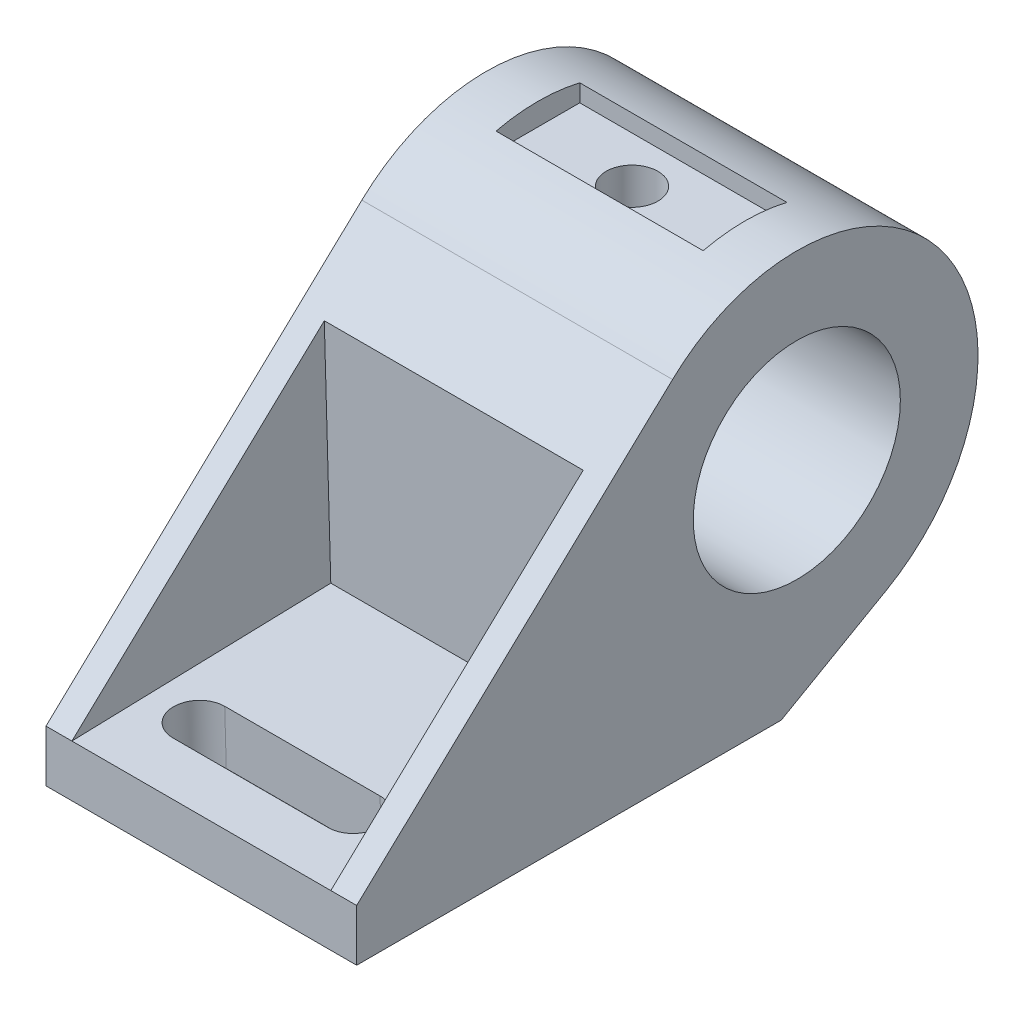
ISO-10303-21;
HEADER;
FILE_DESCRIPTION(('STEP AP214'),'2;1');
FILE_NAME('part.step','',(''),(''),'','','');
FILE_SCHEMA(('AUTOMOTIVE_DESIGN { 1 0 10303 214 1 1 1 1 }'));
ENDSEC;
DATA;
#1=APPLICATION_CONTEXT('core data for automotive mechanical design processes');
#2=APPLICATION_PROTOCOL_DEFINITION('international standard','automotive_design',2000,#1);
#3=PRODUCT_CONTEXT('',#1,'mechanical');
#4=PRODUCT('Part','Part','',(#3));
#5=PRODUCT_RELATED_PRODUCT_CATEGORY('part','',(#4));
#6=PRODUCT_DEFINITION_FORMATION('','',#4);
#7=PRODUCT_DEFINITION_CONTEXT('part definition',#1,'design');
#8=PRODUCT_DEFINITION('design','',#6,#7);
#9=PRODUCT_DEFINITION_SHAPE('','',#8);
#10=(LENGTH_UNIT() NAMED_UNIT(*) SI_UNIT(.MILLI.,.METRE.));
#11=(NAMED_UNIT(*) PLANE_ANGLE_UNIT() SI_UNIT($,.RADIAN.));
#12=(NAMED_UNIT(*) SI_UNIT($,.STERADIAN.) SOLID_ANGLE_UNIT());
#13=UNCERTAINTY_MEASURE_WITH_UNIT(LENGTH_MEASURE(1.E-05),#10,'distance_accuracy_value','');
#14=(GEOMETRIC_REPRESENTATION_CONTEXT(3) GLOBAL_UNCERTAINTY_ASSIGNED_CONTEXT((#13)) GLOBAL_UNIT_ASSIGNED_CONTEXT((#10,
#11,#12)) REPRESENTATION_CONTEXT('',''));
#15=CARTESIAN_POINT('',(0.,0.,0.));
#16=DIRECTION('',(0.,0.,1.));
#17=DIRECTION('',(1.,0.,0.));
#18=AXIS2_PLACEMENT_3D('',#15,#16,#17);
#19=CARTESIAN_POINT('',(-50.,42.,-5.43312891036364));
#20=DIRECTION('',(1.,0.,0.));
#21=DIRECTION('',(0.,0.,-1.));
#22=AXIS2_PLACEMENT_3D('',#19,#20,#21);
#23=CYLINDRICAL_SURFACE('',#22,35.);
#24=CARTESIAN_POINT('',(10.,42.,-5.43312891036364));
#25=DIRECTION('',(1.,0.,0.));
#26=DIRECTION('',(0.,0.,1.));
#27=AXIS2_PLACEMENT_3D('',#24,#25,#26);
#28=CIRCLE('',#27,35.);
#29=CARTESIAN_POINT('',(10.,11.5950440038065,-22.7691795237397));
#30=VERTEX_POINT('',#29);
#31=CARTESIAN_POINT('',(10.,67.4737167405877,18.568740921387));
#32=VERTEX_POINT('',#31);
#33=EDGE_CURVE('E267',#30,#32,#28,.T.);
#34=ORIENTED_EDGE('',*,*,#33,.F.);
#35=DIRECTION('',(1.,0.,0.));
#36=VECTOR('',#35,1.);
#37=CARTESIAN_POINT('',(-50.,11.5950440038065,-22.7691795237397));
#38=LINE('',#37,#36);
#39=CARTESIAN_POINT('',(-50.,11.5950440038065,-22.7691795237397));
#40=VERTEX_POINT('',#39);
#41=EDGE_CURVE('E284',#40,#30,#38,.T.);
#42=ORIENTED_EDGE('',*,*,#41,.F.);
#43=CARTESIAN_POINT('',(-50.,42.,-5.43312891036364));
#44=DIRECTION('',(1.,0.,0.));
#45=DIRECTION('',(0.,0.,1.));
#46=AXIS2_PLACEMENT_3D('',#43,#44,#45);
#47=CIRCLE('',#46,35.);
#48=CARTESIAN_POINT('',(-50.,67.4737167405877,18.568740921387));
#49=VERTEX_POINT('',#48);
#50=EDGE_CURVE('E252',#40,#49,#47,.T.);
#51=ORIENTED_EDGE('',*,*,#50,.T.);
#52=DIRECTION('',(1.,0.,0.));
#53=VECTOR('',#52,1.);
#54=CARTESIAN_POINT('',(-50.,67.4737167405877,18.568740921387));
#55=LINE('',#54,#53);
#56=EDGE_CURVE('E282',#49,#32,#55,.T.);
#57=ORIENTED_EDGE('',*,*,#56,.T.);
#58=EDGE_LOOP('',(#34,#42,#51,#57));
#59=FACE_BOUND('',#58,.T.);
#60=DIRECTION('',(1.,0.,0.));
#61=VECTOR('',#60,1.);
#62=CARTESIAN_POINT('',(-50.,76.0540565694001,2.64902619629556));
#63=LINE('',#62,#61);
#64=CARTESIAN_POINT('',(-40.,76.0540565694001,2.64902619629556));
#65=VERTEX_POINT('',#64);
#66=CARTESIAN_POINT('',(0.,76.0540565694001,2.64902619629556));
#67=VERTEX_POINT('',#66);
#68=EDGE_CURVE('E51',#65,#67,#63,.T.);
#69=ORIENTED_EDGE('',*,*,#68,.F.);
#70=CARTESIAN_POINT('',(-40.,42.,-5.43312891036364));
#71=DIRECTION('',(1.,0.,0.));
#72=DIRECTION('',(0.,0.,-1.));
#73=AXIS2_PLACEMENT_3D('',#70,#71,#72);
#74=CIRCLE('',#73,35.);
#75=CARTESIAN_POINT('',(-40.,76.0540565694001,-13.5152840170228));
#76=VERTEX_POINT('',#75);
#77=EDGE_CURVE('E11',#65,#76,#74,.F.);
#78=ORIENTED_EDGE('',*,*,#77,.T.);
#79=DIRECTION('',(1.,0.,0.));
#80=VECTOR('',#79,1.);
#81=CARTESIAN_POINT('',(-50.,76.0540565694001,-13.5152840170228));
#82=LINE('',#81,#80);
#83=CARTESIAN_POINT('',(0.,76.0540565694001,-13.5152840170228));
#84=VERTEX_POINT('',#83);
#85=EDGE_CURVE('E288',#84,#76,#82,.F.);
#86=ORIENTED_EDGE('',*,*,#85,.F.);
#87=CARTESIAN_POINT('',(0.,42.,-5.43312891036364));
#88=DIRECTION('',(1.,0.,0.));
#89=DIRECTION('',(0.,0.,-1.));
#90=AXIS2_PLACEMENT_3D('',#87,#88,#89);
#91=CIRCLE('',#90,35.);
#92=EDGE_CURVE('E277',#67,#84,#91,.F.);
#93=ORIENTED_EDGE('',*,*,#92,.F.);
#94=EDGE_LOOP('',(#69,#78,#86,#93));
#95=FACE_BOUND('',#94,.T.);
#96=ADVANCED_FACE('F37',(#59,#95),#23,.T.);
#97=CARTESIAN_POINT('',(-50.,0.,79.5668710896364));
#98=DIRECTION('',(0.,-1.,0.));
#99=DIRECTION('',(0.,0.,-1.));
#100=AXIS2_PLACEMENT_3D('',#97,#98,#99);
#101=PLANE('',#100);
#102=CARTESIAN_POINT('',(-35.4978255030121,0.,64.2692734919011));
#103=DIRECTION('',(0.,-1.,0.));
#104=DIRECTION('',(0.,0.,1.));
#105=AXIS2_PLACEMENT_3D('',#102,#103,#104);
#106=ELLIPSE('',#105,5.01190676980095,5.00991902859651);
#107=CARTESIAN_POINT('',(-35.4978255030121,0.,69.281180261702));
#108=VERTEX_POINT('',#107);
#109=CARTESIAN_POINT('',(-35.4978255030121,0.,59.2573667221001));
#110=VERTEX_POINT('',#109);
#111=EDGE_CURVE('E210',#108,#110,#106,.T.);
#112=ORIENTED_EDGE('',*,*,#111,.F.);
#113=DIRECTION('',(-1.,0.,0.));
#114=VECTOR('',#113,1.);
#115=CARTESIAN_POINT('',(-50.,0.,69.281180261702));
#116=LINE('',#115,#114);
#117=CARTESIAN_POINT('',(-5.49782550301206,0.,69.281180261702));
#118=VERTEX_POINT('',#117);
#119=EDGE_CURVE('E199',#118,#108,#116,.T.);
#120=ORIENTED_EDGE('',*,*,#119,.F.);
#121=CARTESIAN_POINT('',(-5.49782550301206,0.,64.2692734919011));
#122=DIRECTION('',(0.,-1.,0.));
#123=DIRECTION('',(0.,0.,1.));
#124=AXIS2_PLACEMENT_3D('',#121,#122,#123);
#125=ELLIPSE('',#124,5.01190676980096,5.00991902859652);
#126=CARTESIAN_POINT('',(-5.49782550301206,0.,59.2573667221001));
#127=VERTEX_POINT('',#126);
#128=EDGE_CURVE('E206',#127,#118,#125,.T.);
#129=ORIENTED_EDGE('',*,*,#128,.F.);
#130=DIRECTION('',(1.,0.,0.));
#131=VECTOR('',#130,1.);
#132=CARTESIAN_POINT('',(-50.,0.,59.2573667221001));
#133=LINE('',#132,#131);
#134=EDGE_CURVE('E208',#110,#127,#133,.T.);
#135=ORIENTED_EDGE('',*,*,#134,.F.);
#136=EDGE_LOOP('',(#112,#120,#129,#135));
#137=FACE_BOUND('',#136,.T.);
#138=DIRECTION('',(0.,0.,-1.));
#139=VECTOR('',#138,1.);
#140=CARTESIAN_POINT('',(10.,0.,79.5668710896364));
#141=LINE('',#140,#139);
#142=CARTESIAN_POINT('',(10.,0.,79.5668710896364));
#143=VERTEX_POINT('',#142);
#144=CARTESIAN_POINT('',(10.,0.,-2.43312891036364));
#145=VERTEX_POINT('',#144);
#146=EDGE_CURVE('E242',#143,#145,#141,.T.);
#147=ORIENTED_EDGE('',*,*,#146,.F.);
#148=DIRECTION('',(1.,0.,0.));
#149=VECTOR('',#148,1.);
#150=CARTESIAN_POINT('',(-50.,0.,79.5668710896364));
#151=LINE('',#150,#149);
#152=CARTESIAN_POINT('',(-50.,0.,79.5668710896364));
#153=VERTEX_POINT('',#152);
#154=EDGE_CURVE('E275',#153,#143,#151,.T.);
#155=ORIENTED_EDGE('',*,*,#154,.F.);
#156=DIRECTION('',(0.,0.,-1.));
#157=VECTOR('',#156,1.);
#158=CARTESIAN_POINT('',(-50.,0.,79.5668710896364));
#159=LINE('',#158,#157);
#160=CARTESIAN_POINT('',(-50.,0.,-2.43312891036364));
#161=VERTEX_POINT('',#160);
#162=EDGE_CURVE('E245',#153,#161,#159,.T.);
#163=ORIENTED_EDGE('',*,*,#162,.T.);
#164=DIRECTION('',(1.,0.,0.));
#165=VECTOR('',#164,1.);
#166=CARTESIAN_POINT('',(-50.,0.,-2.43312891036364));
#167=LINE('',#166,#165);
#168=EDGE_CURVE('E261',#161,#145,#167,.T.);
#169=ORIENTED_EDGE('',*,*,#168,.T.);
#170=EDGE_LOOP('',(#147,#155,#163,#169));
#171=FACE_BOUND('',#170,.T.);
#172=ADVANCED_FACE('F39',(#137,#171),#101,.T.);
#173=CARTESIAN_POINT('',(-50.,0.,79.5668710896364));
#174=DIRECTION('',(0.,0.,1.));
#175=DIRECTION('',(1.,0.,0.));
#176=AXIS2_PLACEMENT_3D('',#173,#174,#175);
#177=PLANE('',#176);
#178=DIRECTION('',(0.,-1.,0.));
#179=VECTOR('',#178,1.);
#180=CARTESIAN_POINT('',(10.,0.,79.5668710896364));
#181=LINE('',#180,#179);
#182=CARTESIAN_POINT('',(10.,10.,79.5668710896364));
#183=VERTEX_POINT('',#182);
#184=EDGE_CURVE('E249',#183,#143,#181,.T.);
#185=ORIENTED_EDGE('',*,*,#184,.F.);
#186=DIRECTION('',(1.,0.,0.));
#187=VECTOR('',#186,1.);
#188=CARTESIAN_POINT('',(-50.,10.,79.5668710896364));
#189=LINE('',#188,#187);
#190=CARTESIAN_POINT('',(5.,10.,79.5668710896364));
#191=VERTEX_POINT('',#190);
#192=EDGE_CURVE('E281',#191,#183,#189,.T.);
#193=ORIENTED_EDGE('',*,*,#192,.F.);
#194=DIRECTION('',(1.,0.,0.));
#195=VECTOR('',#194,1.);
#196=CARTESIAN_POINT('',(-45.,10.,79.5668710896364));
#197=LINE('',#196,#195);
#198=CARTESIAN_POINT('',(-45.,10.,79.5668710896364));
#199=VERTEX_POINT('',#198);
#200=EDGE_CURVE('E223',#199,#191,#197,.T.);
#201=ORIENTED_EDGE('',*,*,#200,.F.);
#202=CARTESIAN_POINT('',(-50.,10.,79.5668710896364));
#203=VERTEX_POINT('',#202);
#204=EDGE_CURVE('E278',#203,#199,#189,.T.);
#205=ORIENTED_EDGE('',*,*,#204,.F.);
#206=DIRECTION('',(0.,-1.,0.));
#207=VECTOR('',#206,1.);
#208=CARTESIAN_POINT('',(-50.,0.,79.5668710896364));
#209=LINE('',#208,#207);
#210=EDGE_CURVE('E258',#203,#153,#209,.T.);
#211=ORIENTED_EDGE('',*,*,#210,.T.);
#212=ORIENTED_EDGE('',*,*,#154,.T.);
#213=EDGE_LOOP('',(#185,#193,#201,#205,#211,#212));
#214=FACE_BOUND('',#213,.T.);
#215=ADVANCED_FACE('F314',(#214),#177,.T.);
#216=CARTESIAN_POINT('',(-50.,10.,79.5668710896364));
#217=DIRECTION('',(0.,0.727820478302506,0.68576770947859));
#218=DIRECTION('',(0.,-0.68576770947859,0.727820478302506));
#219=AXIS2_PLACEMENT_3D('',#216,#217,#218);
#220=PLANE('',#219);
#221=DIRECTION('',(0.,-0.68576770947859,0.727820478302506));
#222=VECTOR('',#221,1.);
#223=CARTESIAN_POINT('',(-45.,55.9292672426523,30.8211211941691));
#224=LINE('',#223,#222);
#225=CARTESIAN_POINT('',(-45.,55.9292672426523,30.8211211941691));
#226=VERTEX_POINT('',#225);
#227=EDGE_CURVE('E213',#226,#199,#224,.T.);
#228=ORIENTED_EDGE('',*,*,#227,.F.);
#229=DIRECTION('',(1.,0.,0.));
#230=VECTOR('',#229,1.);
#231=CARTESIAN_POINT('',(-45.,55.9292672426523,30.8211211941691));
#232=LINE('',#231,#230);
#233=CARTESIAN_POINT('',(5.,55.9292672426523,30.8211211941691));
#234=VERTEX_POINT('',#233);
#235=EDGE_CURVE('E231',#226,#234,#232,.T.);
#236=ORIENTED_EDGE('',*,*,#235,.T.);
#237=DIRECTION('',(0.,-0.68576770947859,0.727820478302506));
#238=VECTOR('',#237,1.);
#239=CARTESIAN_POINT('',(5.,55.9292672426523,30.8211211941691));
#240=LINE('',#239,#238);
#241=EDGE_CURVE('E212',#234,#191,#240,.T.);
#242=ORIENTED_EDGE('',*,*,#241,.T.);
#243=ORIENTED_EDGE('',*,*,#192,.T.);
#244=DIRECTION('',(0.,-0.68576770947859,0.727820478302506));
#245=VECTOR('',#244,1.);
#246=CARTESIAN_POINT('',(10.,10.,79.5668710896364));
#247=LINE('',#246,#245);
#248=EDGE_CURVE('E270',#32,#183,#247,.T.);
#249=ORIENTED_EDGE('',*,*,#248,.F.);
#250=ORIENTED_EDGE('',*,*,#56,.F.);
#251=DIRECTION('',(0.,-0.68576770947859,0.727820478302506));
#252=VECTOR('',#251,1.);
#253=CARTESIAN_POINT('',(-50.,10.,79.5668710896364));
#254=LINE('',#253,#252);
#255=EDGE_CURVE('E255',#49,#203,#254,.T.);
#256=ORIENTED_EDGE('',*,*,#255,.T.);
#257=ORIENTED_EDGE('',*,*,#204,.T.);
#258=EDGE_LOOP('',(#228,#236,#242,#243,#249,#250,#256,#257));
#259=FACE_BOUND('',#258,.T.);
#260=ADVANCED_FACE('F318',(#259),#220,.T.);
#261=CARTESIAN_POINT('',(-50.,11.5950440038065,-22.7691795237397));
#262=DIRECTION('',(0.,-0.868713028462672,-0.495315731810744));
#263=DIRECTION('',(0.,0.495315731810744,-0.868713028462672));
#264=AXIS2_PLACEMENT_3D('',#261,#262,#263);
#265=PLANE('',#264);
#266=DIRECTION('',(0.,0.495315731810744,-0.868713028462672));
#267=VECTOR('',#266,1.);
#268=CARTESIAN_POINT('',(10.,11.5950440038065,-22.7691795237397));
#269=LINE('',#268,#267);
#270=EDGE_CURVE('E264',#145,#30,#269,.T.);
#271=ORIENTED_EDGE('',*,*,#270,.F.);
#272=ORIENTED_EDGE('',*,*,#168,.F.);
#273=DIRECTION('',(0.,0.495315731810744,-0.868713028462672));
#274=VECTOR('',#273,1.);
#275=CARTESIAN_POINT('',(-50.,11.5950440038065,-22.7691795237397));
#276=LINE('',#275,#274);
#277=EDGE_CURVE('E248',#161,#40,#276,.T.);
#278=ORIENTED_EDGE('',*,*,#277,.T.);
#279=ORIENTED_EDGE('',*,*,#41,.T.);
#280=EDGE_LOOP('',(#271,#272,#278,#279));
#281=FACE_BOUND('',#280,.T.);
#282=ADVANCED_FACE('F320',(#281),#265,.T.);
#283=CARTESIAN_POINT('',(-50.,42.,-5.43312891036364));
#284=DIRECTION('',(-1.,0.,0.));
#285=DIRECTION('',(0.,0.,1.));
#286=AXIS2_PLACEMENT_3D('',#283,#284,#285);
#287=PLANE('',#286);
#288=CARTESIAN_POINT('',(-50.,42.,-5.43312891036364));
#289=DIRECTION('',(1.,0.,0.));
#290=DIRECTION('',(0.,0.,-1.));
#291=AXIS2_PLACEMENT_3D('',#288,#289,#290);
#292=CIRCLE('',#291,20.);
#293=CARTESIAN_POINT('',(-50.,42.,-25.4331289103636));
#294=VERTEX_POINT('',#293);
#295=EDGE_CURVE('E239',#294,#294,#292,.T.);
#296=ORIENTED_EDGE('',*,*,#295,.T.);
#297=EDGE_LOOP('',(#296));
#298=FACE_BOUND('',#297,.T.);
#299=ORIENTED_EDGE('',*,*,#162,.F.);
#300=ORIENTED_EDGE('',*,*,#210,.F.);
#301=ORIENTED_EDGE('',*,*,#255,.F.);
#302=ORIENTED_EDGE('',*,*,#50,.F.);
#303=ORIENTED_EDGE('',*,*,#277,.F.);
#304=EDGE_LOOP('',(#299,#300,#301,#302,#303));
#305=FACE_BOUND('',#304,.T.);
#306=ADVANCED_FACE('F322',(#298,#305),#287,.T.);
#307=CARTESIAN_POINT('',(10.,42.,-5.43312891036364));
#308=DIRECTION('',(-1.,0.,0.));
#309=DIRECTION('',(0.,0.,1.));
#310=AXIS2_PLACEMENT_3D('',#307,#308,#309);
#311=PLANE('',#310);
#312=CARTESIAN_POINT('',(10.,42.,-5.43312891036364));
#313=DIRECTION('',(1.,0.,0.));
#314=DIRECTION('',(0.,0.,-1.));
#315=AXIS2_PLACEMENT_3D('',#312,#313,#314);
#316=CIRCLE('',#315,20.);
#317=CARTESIAN_POINT('',(10.,42.,-25.4331289103636));
#318=VERTEX_POINT('',#317);
#319=EDGE_CURVE('E234',#318,#318,#316,.T.);
#320=ORIENTED_EDGE('',*,*,#319,.F.);
#321=EDGE_LOOP('',(#320));
#322=FACE_BOUND('',#321,.T.);
#323=ORIENTED_EDGE('',*,*,#146,.T.);
#324=ORIENTED_EDGE('',*,*,#270,.T.);
#325=ORIENTED_EDGE('',*,*,#33,.T.);
#326=ORIENTED_EDGE('',*,*,#248,.T.);
#327=ORIENTED_EDGE('',*,*,#184,.T.);
#328=EDGE_LOOP('',(#323,#324,#325,#326,#327));
#329=FACE_BOUND('',#328,.T.);
#330=ADVANCED_FACE('F328',(#322,#329),#311,.F.);
#331=CARTESIAN_POINT('',(-50.,42.,-5.43312891036364));
#332=DIRECTION('',(1.,0.,0.));
#333=DIRECTION('',(0.,0.,-1.));
#334=AXIS2_PLACEMENT_3D('',#331,#332,#333);
#335=CYLINDRICAL_SURFACE('',#334,20.);
#336=CARTESIAN_POINT('',(-21.0040889167803,61.1350109164291,0.385063010511854));
#337=CARTESIAN_POINT('',(-20.8670221858126,61.1350078519928,0.385067344026098));
#338=CARTESIAN_POINT('',(-20.730000875326,61.1367272382406,0.379425745192355));
#339=CARTESIAN_POINT('',(-20.4569261940195,61.1435493674619,0.356920581346241));
#340=CARTESIAN_POINT('',(-20.3208729567487,61.1486525684361,0.340055497229117));
#341=CARTESIAN_POINT('',(-20.0507302337885,61.1621058103301,0.295242769801606));
#342=CARTESIAN_POINT('',(-19.9166413883596,61.1704568864392,0.267291592984923));
#343=CARTESIAN_POINT('',(-19.6513675130776,61.1901781586751,0.200544239447774));
#344=CARTESIAN_POINT('',(-19.5201835871817,61.2015494819567,0.161744013582178));
#345=CARTESIAN_POINT('',(-19.2619255412233,61.2269807978453,0.0737124725848915));
#346=CARTESIAN_POINT('',(-19.1348436479616,61.2410353078421,0.0245024063153705));
#347=CARTESIAN_POINT('',(-18.885332194749,61.2714807055382,-0.083997977524717));
#348=CARTESIAN_POINT('',(-18.7629043764955,61.2878724572123,-0.143292024265557));
#349=CARTESIAN_POINT('',(-18.4038802833637,61.3399371423428,-0.335629090896694));
#350=CARTESIAN_POINT('',(-18.1752895517502,61.3785257157113,-0.483214057501158));
#351=CARTESIAN_POINT('',(-17.7399163883202,61.4608274482046,-0.817236903405134));
#352=CARTESIAN_POINT('',(-17.5338628961715,61.5046484422544,-1.00459201787022));
#353=CARTESIAN_POINT('',(-17.155594427672,61.5924601698431,-1.41086121597794));
#354=CARTESIAN_POINT('',(-16.9833845738588,61.6364509280514,-1.62978006839481));
#355=CARTESIAN_POINT('',(-16.6736467436738,61.7216633417738,-2.09933059845364));
#356=CARTESIAN_POINT('',(-16.5370631838169,61.7627917366976,-2.3506036081373));
#357=CARTESIAN_POINT('',(-16.3083877290295,61.8373165473308,-2.87371979874313));
#358=CARTESIAN_POINT('',(-16.2162904845595,61.8707138924578,-3.14556050182286));
#359=CARTESIAN_POINT('',(-16.0810102567119,61.926403025763,-3.69707817073685));
#360=CARTESIAN_POINT('',(-16.0369844706084,61.948882195668,-3.9765290184835));
#361=CARTESIAN_POINT('',(-15.9967025091636,61.9820151673714,-4.53952970278797));
#362=CARTESIAN_POINT('',(-16.0004369855806,61.9926712828836,-4.82307872634645));
#363=CARTESIAN_POINT('',(-16.0549564304612,62.0017889913764,-5.37743864584607));
#364=CARTESIAN_POINT('',(-16.1043683035879,62.0005966082415,-5.64838004826288));
#365=CARTESIAN_POINT('',(-16.246852812595,61.9878725872532,-6.17825864064669));
#366=CARTESIAN_POINT('',(-16.3399256546556,61.9763409005744,-6.43719577391957));
#367=CARTESIAN_POINT('',(-16.5669306096978,61.9450314438568,-6.93585882993901));
#368=CARTESIAN_POINT('',(-16.7008554041758,61.9252551505819,-7.17558818399606));
#369=CARTESIAN_POINT('',(-17.0057785111416,61.88033061331,-7.62962153195151));
#370=CARTESIAN_POINT('',(-17.1767820420613,61.8551816131698,-7.84392194042497));
#371=CARTESIAN_POINT('',(-17.5556670849137,61.8022344918319,-8.24625900607799));
#372=CARTESIAN_POINT('',(-17.7643129734814,61.7743884037898,-8.43356993746647));
#373=CARTESIAN_POINT('',(-18.2100745582873,61.720265764807,-8.77084945770359));
#374=CARTESIAN_POINT('',(-18.4471921694914,61.6939893196165,-8.92081553270507));
#375=CARTESIAN_POINT('',(-18.9459889314972,61.646250688612,-9.18046262847913));
#376=CARTESIAN_POINT('',(-19.2078842225263,61.624837727801,-9.28973833308747));
#377=CARTESIAN_POINT('',(-19.7468553210124,61.5900880941587,-9.4625573240039));
#378=CARTESIAN_POINT('',(-20.0239289893442,61.5767502864536,-9.52610703683346));
#379=CARTESIAN_POINT('',(-20.5803396810202,61.5601470883174,-9.60472963924342));
#380=CARTESIAN_POINT('',(-20.8595574838018,61.5567137712482,-9.62061091808229));
#381=CARTESIAN_POINT('',(-21.4166680471579,61.55990692718,-9.60566993702693));
#382=CARTESIAN_POINT('',(-21.6945608976195,61.5665327077256,-9.57485089192332));
#383=CARTESIAN_POINT('',(-22.2375776227282,61.5888002924352,-9.4681972252761));
#384=CARTESIAN_POINT('',(-22.5028169856031,61.6043294636846,-9.39292461527419));
#385=CARTESIAN_POINT('',(-23.0169321744628,61.6422862682524,-9.20011479118944));
#386=CARTESIAN_POINT('',(-23.2658063840209,61.6647145817778,-9.0825734095102));
#387=CARTESIAN_POINT('',(-23.7440554074124,61.7139458393713,-8.80658304886481));
#388=CARTESIAN_POINT('',(-23.9731000859067,61.7408068106165,-8.64757256077752));
#389=CARTESIAN_POINT('',(-24.4016166174477,61.7951641855437,-8.29379821341711));
#390=CARTESIAN_POINT('',(-24.6010851208461,61.8226606607927,-8.09903031002183));
#391=CARTESIAN_POINT('',(-24.9680161064552,61.8750586966924,-7.67549464908619));
#392=CARTESIAN_POINT('',(-25.1349190282911,61.8999120253757,-7.44623536130312));
#393=CARTESIAN_POINT('',(-25.4278394175261,61.9429273305409,-6.96235955552772));
#394=CARTESIAN_POINT('',(-25.5538606328559,61.9610899204333,-6.70774536480695));
#395=CARTESIAN_POINT('',(-25.7599330870704,61.9876209556133,-6.18348410941016));
#396=CARTESIAN_POINT('',(-25.8405031554426,61.996101121054,-5.91404692129316));
#397=CARTESIAN_POINT('',(-25.9553867343985,62.0017648994965,-5.3653862082955));
#398=CARTESIAN_POINT('',(-25.9897077426388,61.998950343834,-5.08616427719851));
#399=CARTESIAN_POINT('',(-26.0109063987022,61.981593196198,-4.53262550599819));
#400=CARTESIAN_POINT('',(-25.9988350613376,61.9673161460364,-4.25833981013275));
#401=CARTESIAN_POINT('',(-25.930235675795,61.9280209323801,-3.71619198576206));
#402=CARTESIAN_POINT('',(-25.8737068247719,61.9030025749149,-3.44832997335026));
#403=CARTESIAN_POINT('',(-25.7179109233095,61.8439092931654,-2.92537865541788));
#404=CARTESIAN_POINT('',(-25.6184920191201,61.8098023560387,-2.67033836193058));
#405=CARTESIAN_POINT('',(-25.3799319354519,61.7353033554563,-2.18055460673207));
#406=CARTESIAN_POINT('',(-25.2407841950933,61.6949102543958,-1.94581450577427));
#407=CARTESIAN_POINT('',(-24.9218615055123,61.6099714655961,-1.49573307261213));
#408=CARTESIAN_POINT('',(-24.7409950074557,61.5653376631552,-1.28118286066193));
#409=CARTESIAN_POINT('',(-24.3456747782557,61.4770707813062,-0.885055253322225));
#410=CARTESIAN_POINT('',(-24.1312121764343,61.4334379696968,-0.70348659376696));
#411=CARTESIAN_POINT('',(-23.786847711411,61.3716171409681,-0.458419835742884));
#412=CARTESIAN_POINT('',(-23.6671526266056,61.3514579811982,-0.380732955103088));
#413=CARTESIAN_POINT('',(-23.4213504236097,61.3130265514134,-0.235762144743622));
#414=CARTESIAN_POINT('',(-23.2952457631194,61.2947535661852,-0.168474267007314));
#415=CARTESIAN_POINT('',(-23.0375387476493,61.2606023442889,-0.0448717166675359));
#416=CARTESIAN_POINT('',(-22.9059392786189,61.2447228702263,0.0114486303440376));
#417=CARTESIAN_POINT('',(-22.6381639406476,61.2157966544441,0.112672882615557));
#418=CARTESIAN_POINT('',(-22.5019888513374,61.2027494329407,0.157578721713931));
#419=CARTESIAN_POINT('',(-22.1435967944574,61.1730424576914,0.258860393675207));
#420=CARTESIAN_POINT('',(-21.9185137005405,61.1588709857022,0.306097226335984));
#421=CARTESIAN_POINT('',(-21.4636071666393,61.139858309649,0.369193131752317));
#422=CARTESIAN_POINT('',(-21.2337842650128,61.1350160517872,0.385055748442815));
#423=CARTESIAN_POINT('',(-21.0040889167803,61.1350109164291,0.385063010511854));
#424=B_SPLINE_CURVE_WITH_KNOTS('',3,(#336,#337,#338,#339,#340,#341,#342,#343,#344,#345,#346,
#347,#348,#349,#350,#351,#352,#353,#354,#355,#356,#357,#358,#359,#360,#361,#362,#363,#364,#365,
#366,#367,#368,#369,#370,#371,#372,#373,#374,#375,#376,#377,#378,#379,#380,#381,#382,#383,#384,
#385,#386,#387,#388,#389,#390,#391,#392,#393,#394,#395,#396,#397,#398,#399,#400,#401,#402,#403,
#404,#405,#406,#407,#408,#409,#410,#411,#412,#413,#414,#415,#416,#417,#418,#419,#420,#421,#422,
#423),.UNSPECIFIED.,.T.,.F.,(4,2,2,2,2,2,2,2,2,2,2,2,2,2,2,2,2,2,2,2,2,2,2,2,2,2,2,2,2,2,2,2,2,
2,2,2,2,2,2,2,2,2,2,4),(0.,0.410995308855245,0.822046257463126,1.23322832709574,
1.64456406580402,2.05506813937514,2.46572435343431,3.28623775577591,4.1282643535752,
4.97041830164806,5.83303578269233,6.69554950697654,7.54268574598651,8.38965617533254,
9.21196608213838,10.0342798721788,10.8564464336246,11.6787287813323,12.5201121871732,
13.3615522149448,14.2111627981885,15.0606539502837,15.895655160884,16.7305988936793,
17.5552061098256,18.3798946525069,19.2163886853719,20.0529773830882,20.9028730112272,
21.752690701068,22.5926004477628,23.4323740162812,24.2532359526738,25.0741127131132,
25.8979199809555,26.7218633723356,27.5704731473933,28.4193073672786,28.8512075059558,
29.2829432673252,29.7144550592264,30.1458936958837,30.8347142089992,31.5234569106235),.UNSPECIFIED.);
#425=CARTESIAN_POINT('',(-21.0040889167803,61.1350109164291,0.385063010511854));
#426=VERTEX_POINT('',#425);
#427=EDGE_CURVE('E41',#426,#426,#424,.T.);
#428=ORIENTED_EDGE('',*,*,#427,.T.);
#429=EDGE_LOOP('',(#428));
#430=FACE_BOUND('',#429,.T.);
#431=ORIENTED_EDGE('',*,*,#295,.F.);
#432=EDGE_LOOP('',(#431));
#433=FACE_BOUND('',#432,.T.);
#434=ORIENTED_EDGE('',*,*,#319,.T.);
#435=EDGE_LOOP('',(#434));
#436=FACE_BOUND('',#435,.T.);
#437=ADVANCED_FACE('F372',(#430,#433,#436),#335,.F.);
#438=CARTESIAN_POINT('',(-45.,11.4086160824786,29.5668710896364));
#439=DIRECTION('',(0.,0.0281611484001197,-0.999603396213111));
#440=DIRECTION('',(0.,0.999603396213111,0.0281611484001197));
#441=AXIS2_PLACEMENT_3D('',#438,#439,#440);
#442=PLANE('',#441);
#443=DIRECTION('',(0.,0.999603396213111,0.0281611484001197));
#444=VECTOR('',#443,1.);
#445=CARTESIAN_POINT('',(5.,11.4086160824786,29.5668710896364));
#446=LINE('',#445,#444);
#447=CARTESIAN_POINT('',(5.,11.4086160824786,29.5668710896364));
#448=VERTEX_POINT('',#447);
#449=EDGE_CURVE('E217',#448,#234,#446,.T.);
#450=ORIENTED_EDGE('',*,*,#449,.T.);
#451=ORIENTED_EDGE('',*,*,#235,.F.);
#452=DIRECTION('',(0.,0.999603396213111,0.0281611484001197));
#453=VECTOR('',#452,1.);
#454=CARTESIAN_POINT('',(-45.,11.4086160824786,29.5668710896364));
#455=LINE('',#454,#453);
#456=CARTESIAN_POINT('',(-45.,11.4086160824786,29.5668710896364));
#457=VERTEX_POINT('',#456);
#458=EDGE_CURVE('E220',#457,#226,#455,.T.);
#459=ORIENTED_EDGE('',*,*,#458,.F.);
#460=DIRECTION('',(1.,0.,0.));
#461=VECTOR('',#460,1.);
#462=CARTESIAN_POINT('',(-45.,11.4086160824786,29.5668710896364));
#463=LINE('',#462,#461);
#464=EDGE_CURVE('E235',#457,#448,#463,.T.);
#465=ORIENTED_EDGE('',*,*,#464,.T.);
#466=EDGE_LOOP('',(#450,#451,#459,#465));
#467=FACE_BOUND('',#466,.T.);
#468=ADVANCED_FACE('F352',(#467),#442,.F.);
#469=CARTESIAN_POINT('',(-45.,10.,79.5668710896364));
#470=DIRECTION('',(0.,-0.999603396213111,-0.0281611484001195));
#471=DIRECTION('',(0.,0.0281611484001195,-0.999603396213111));
#472=AXIS2_PLACEMENT_3D('',#469,#470,#471);
#473=PLANE('',#472);
#474=DIRECTION('',(1.,0.,0.));
#475=VECTOR('',#474,1.);
#476=CARTESIAN_POINT('',(-35.4978255030121,10.2816114840012,69.5708371275052));
#477=LINE('',#476,#475);
#478=CARTESIAN_POINT('',(-35.4978255030121,10.2816114840012,69.5708371275052));
#479=VERTEX_POINT('',#478);
#480=CARTESIAN_POINT('',(-5.49782550301206,10.2816114840012,69.5708371275053));
#481=VERTEX_POINT('',#480);
#482=EDGE_CURVE('E188',#479,#481,#477,.T.);
#483=ORIENTED_EDGE('',*,*,#482,.F.);
#484=CARTESIAN_POINT('',(-35.4978255030121,10.4226965572381,64.5629050517675));
#485=DIRECTION('',(0.,0.999603396213111,0.0281611484001195));
#486=DIRECTION('',(0.,-0.0281611484001195,0.999603396213111));
#487=AXIS2_PLACEMENT_3D('',#484,#485,#486);
#488=CIRCLE('',#487,5.00991902859651);
#489=CARTESIAN_POINT('',(-35.4978255030121,10.563781630475,59.5549729760297));
#490=VERTEX_POINT('',#489);
#491=EDGE_CURVE('E185',#490,#479,#488,.T.);
#492=ORIENTED_EDGE('',*,*,#491,.F.);
#493=DIRECTION('',(-1.,0.,0.));
#494=VECTOR('',#493,1.);
#495=CARTESIAN_POINT('',(-35.4978255030121,10.563781630475,59.5549729760297));
#496=LINE('',#495,#494);
#497=CARTESIAN_POINT('',(-5.49782550301206,10.563781630475,59.5549729760297));
#498=VERTEX_POINT('',#497);
#499=EDGE_CURVE('E193',#498,#490,#496,.T.);
#500=ORIENTED_EDGE('',*,*,#499,.F.);
#501=CARTESIAN_POINT('',(-5.49782550301206,10.4226965572381,64.5629050517675));
#502=DIRECTION('',(0.,0.999603396213111,0.0281611484001195));
#503=DIRECTION('',(0.,-0.0281611484001195,0.999603396213111));
#504=AXIS2_PLACEMENT_3D('',#501,#502,#503);
#505=CIRCLE('',#504,5.00991902859652);
#506=EDGE_CURVE('E190',#481,#498,#505,.T.);
#507=ORIENTED_EDGE('',*,*,#506,.F.);
#508=EDGE_LOOP('',(#483,#492,#500,#507));
#509=FACE_BOUND('',#508,.T.);
#510=DIRECTION('',(0.,0.0281611484001195,-0.999603396213111));
#511=VECTOR('',#510,1.);
#512=CARTESIAN_POINT('',(5.,10.,79.5668710896364));
#513=LINE('',#512,#511);
#514=EDGE_CURVE('E226',#191,#448,#513,.T.);
#515=ORIENTED_EDGE('',*,*,#514,.T.);
#516=ORIENTED_EDGE('',*,*,#464,.F.);
#517=DIRECTION('',(0.,0.0281611484001195,-0.999603396213111));
#518=VECTOR('',#517,1.);
#519=CARTESIAN_POINT('',(-45.,10.,79.5668710896364));
#520=LINE('',#519,#518);
#521=EDGE_CURVE('E216',#199,#457,#520,.T.);
#522=ORIENTED_EDGE('',*,*,#521,.F.);
#523=ORIENTED_EDGE('',*,*,#200,.T.);
#524=EDGE_LOOP('',(#515,#516,#522,#523));
#525=FACE_BOUND('',#524,.T.);
#526=ADVANCED_FACE('F355',(#509,#525),#473,.F.);
#527=CARTESIAN_POINT('',(-45.,0.,0.));
#528=DIRECTION('',(-1.,0.,0.));
#529=DIRECTION('',(0.,0.,1.));
#530=AXIS2_PLACEMENT_3D('',#527,#528,#529);
#531=PLANE('',#530);
#532=ORIENTED_EDGE('',*,*,#227,.T.);
#533=ORIENTED_EDGE('',*,*,#521,.T.);
#534=ORIENTED_EDGE('',*,*,#458,.T.);
#535=EDGE_LOOP('',(#532,#533,#534));
#536=FACE_BOUND('',#535,.T.);
#537=ADVANCED_FACE('F357',(#536),#531,.F.);
#538=CARTESIAN_POINT('',(5.,0.,0.));
#539=DIRECTION('',(-1.,0.,0.));
#540=DIRECTION('',(0.,0.,1.));
#541=AXIS2_PLACEMENT_3D('',#538,#539,#540);
#542=PLANE('',#541);
#543=ORIENTED_EDGE('',*,*,#241,.F.);
#544=ORIENTED_EDGE('',*,*,#449,.F.);
#545=ORIENTED_EDGE('',*,*,#514,.F.);
#546=EDGE_LOOP('',(#543,#544,#545));
#547=FACE_BOUND('',#546,.T.);
#548=ADVANCED_FACE('F350',(#547),#542,.T.);
#549=CARTESIAN_POINT('',(-35.4978255030121,-39.5574732534175,63.1548476317615));
#550=DIRECTION('',(0.,0.999603396213111,0.0281611484001195));
#551=DIRECTION('',(0.,-0.0281611484001195,0.999603396213111));
#552=AXIS2_PLACEMENT_3D('',#549,#550,#551);
#553=CYLINDRICAL_SURFACE('',#552,5.00991902859651);
#554=ORIENTED_EDGE('',*,*,#111,.T.);
#555=DIRECTION('',(0.,0.999603396213111,0.0281611484001195));
#556=VECTOR('',#555,1.);
#557=CARTESIAN_POINT('',(-35.4978255030121,-39.4163881801806,58.1469155560237));
#558=LINE('',#557,#556);
#559=EDGE_CURVE('E197',#110,#490,#558,.T.);
#560=ORIENTED_EDGE('',*,*,#559,.T.);
#561=ORIENTED_EDGE('',*,*,#491,.T.);
#562=DIRECTION('',(0.,0.999603396213111,0.0281611484001195));
#563=VECTOR('',#562,1.);
#564=CARTESIAN_POINT('',(-35.4978255030121,-39.6985583266544,68.1627797074993));
#565=LINE('',#564,#563);
#566=EDGE_CURVE('E196',#108,#479,#565,.T.);
#567=ORIENTED_EDGE('',*,*,#566,.F.);
#568=EDGE_LOOP('',(#554,#560,#561,#567));
#569=FACE_BOUND('',#568,.T.);
#570=ADVANCED_FACE('F364',(#569),#553,.F.);
#571=CARTESIAN_POINT('',(-35.4978255030121,-39.4163881801806,58.1469155560237));
#572=DIRECTION('',(0.,0.0281611484001195,-0.999603396213111));
#573=DIRECTION('',(0.,0.999603396213111,0.0281611484001195));
#574=AXIS2_PLACEMENT_3D('',#571,#572,#573);
#575=PLANE('',#574);
#576=ORIENTED_EDGE('',*,*,#134,.T.);
#577=DIRECTION('',(0.,0.999603396213111,0.0281611484001195));
#578=VECTOR('',#577,1.);
#579=CARTESIAN_POINT('',(-5.49782550301206,-39.4163881801806,58.1469155560237));
#580=LINE('',#579,#578);
#581=EDGE_CURVE('E200',#127,#498,#580,.T.);
#582=ORIENTED_EDGE('',*,*,#581,.T.);
#583=ORIENTED_EDGE('',*,*,#499,.T.);
#584=ORIENTED_EDGE('',*,*,#559,.F.);
#585=EDGE_LOOP('',(#576,#582,#583,#584));
#586=FACE_BOUND('',#585,.T.);
#587=ADVANCED_FACE('F444',(#586),#575,.F.);
#588=CARTESIAN_POINT('',(-5.49782550301206,-39.5574732534175,63.1548476317615));
#589=DIRECTION('',(0.,0.999603396213111,0.0281611484001195));
#590=DIRECTION('',(0.,-0.0281611484001195,0.999603396213111));
#591=AXIS2_PLACEMENT_3D('',#588,#589,#590);
#592=CYLINDRICAL_SURFACE('',#591,5.00991902859652);
#593=ORIENTED_EDGE('',*,*,#128,.T.);
#594=DIRECTION('',(0.,0.999603396213111,0.0281611484001195));
#595=VECTOR('',#594,1.);
#596=CARTESIAN_POINT('',(-5.49782550301206,-39.6985583266544,68.1627797074993));
#597=LINE('',#596,#595);
#598=EDGE_CURVE('E66',#118,#481,#597,.T.);
#599=ORIENTED_EDGE('',*,*,#598,.T.);
#600=ORIENTED_EDGE('',*,*,#506,.T.);
#601=ORIENTED_EDGE('',*,*,#581,.F.);
#602=EDGE_LOOP('',(#593,#599,#600,#601));
#603=FACE_BOUND('',#602,.T.);
#604=ADVANCED_FACE('F454',(#603),#592,.F.);
#605=CARTESIAN_POINT('',(-35.4978255030121,-39.6985583266544,68.1627797074993));
#606=DIRECTION('',(0.,-0.0281611484001195,0.999603396213111));
#607=DIRECTION('',(0.,-0.999603396213111,-0.0281611484001195));
#608=AXIS2_PLACEMENT_3D('',#605,#606,#607);
#609=PLANE('',#608);
#610=ORIENTED_EDGE('',*,*,#119,.T.);
#611=ORIENTED_EDGE('',*,*,#566,.T.);
#612=ORIENTED_EDGE('',*,*,#482,.T.);
#613=ORIENTED_EDGE('',*,*,#598,.F.);
#614=EDGE_LOOP('',(#610,#611,#612,#613));
#615=FACE_BOUND('',#614,.T.);
#616=ADVANCED_FACE('F305',(#615),#609,.F.);
#617=CARTESIAN_POINT('',(-40.,81.8850086125467,2.64902619629556));
#618=DIRECTION('',(0.,0.,1.));
#619=DIRECTION('',(0.,-1.,0.));
#620=AXIS2_PLACEMENT_3D('',#617,#618,#619);
#621=PLANE('',#620);
#622=ORIENTED_EDGE('',*,*,#68,.T.);
#623=DIRECTION('',(0.,-1.,0.));
#624=VECTOR('',#623,1.);
#625=CARTESIAN_POINT('',(0.,81.8850086125467,2.64902619629556));
#626=LINE('',#625,#624);
#627=CARTESIAN_POINT('',(0.,72.7036804113818,2.64902619629556));
#628=VERTEX_POINT('',#627);
#629=EDGE_CURVE('E58',#67,#628,#626,.T.);
#630=ORIENTED_EDGE('',*,*,#629,.T.);
#631=DIRECTION('',(1.,0.,0.));
#632=VECTOR('',#631,1.);
#633=CARTESIAN_POINT('',(-40.,72.7036804113818,2.64902619629556));
#634=LINE('',#633,#632);
#635=CARTESIAN_POINT('',(-40.,72.7036804113818,2.64902619629556));
#636=VERTEX_POINT('',#635);
#637=EDGE_CURVE('E167',#636,#628,#634,.T.);
#638=ORIENTED_EDGE('',*,*,#637,.F.);
#639=DIRECTION('',(0.,-1.,0.));
#640=VECTOR('',#639,1.);
#641=CARTESIAN_POINT('',(-40.,81.8850086125467,2.64902619629556));
#642=LINE('',#641,#640);
#643=EDGE_CURVE('E156',#65,#636,#642,.T.);
#644=ORIENTED_EDGE('',*,*,#643,.F.);
#645=EDGE_LOOP('',(#622,#630,#638,#644));
#646=FACE_BOUND('',#645,.T.);
#647=ADVANCED_FACE('F168',(#646),#621,.F.);
#648=CARTESIAN_POINT('',(-40.,72.7036804113818,-13.5152840170228));
#649=DIRECTION('',(0.,0.,-1.));
#650=DIRECTION('',(-1.,0.,0.));
#651=AXIS2_PLACEMENT_3D('',#648,#649,#650);
#652=PLANE('',#651);
#653=ORIENTED_EDGE('',*,*,#85,.T.);
#654=DIRECTION('',(0.,1.,0.));
#655=VECTOR('',#654,1.);
#656=CARTESIAN_POINT('',(-40.,72.7036804113818,-13.5152840170228));
#657=LINE('',#656,#655);
#658=CARTESIAN_POINT('',(-40.,72.7036804113818,-13.5152840170228));
#659=VERTEX_POINT('',#658);
#660=EDGE_CURVE('E172',#659,#76,#657,.T.);
#661=ORIENTED_EDGE('',*,*,#660,.F.);
#662=DIRECTION('',(1.,0.,0.));
#663=VECTOR('',#662,1.);
#664=CARTESIAN_POINT('',(-40.,72.7036804113818,-13.5152840170228));
#665=LINE('',#664,#663);
#666=CARTESIAN_POINT('',(0.,72.7036804113818,-13.5152840170228));
#667=VERTEX_POINT('',#666);
#668=EDGE_CURVE('E171',#659,#667,#665,.T.);
#669=ORIENTED_EDGE('',*,*,#668,.T.);
#670=DIRECTION('',(0.,1.,0.));
#671=VECTOR('',#670,1.);
#672=CARTESIAN_POINT('',(0.,72.7036804113818,-13.5152840170228));
#673=LINE('',#672,#671);
#674=EDGE_CURVE('E164',#667,#84,#673,.T.);
#675=ORIENTED_EDGE('',*,*,#674,.T.);
#676=EDGE_LOOP('',(#653,#661,#669,#675));
#677=FACE_BOUND('',#676,.T.);
#678=ADVANCED_FACE('F296',(#677),#652,.F.);
#679=CARTESIAN_POINT('',(-40.,72.7036804113818,2.64902619629556));
#680=DIRECTION('',(0.,-1.,0.));
#681=DIRECTION('',(0.,0.,-1.));
#682=AXIS2_PLACEMENT_3D('',#679,#680,#681);
#683=PLANE('',#682);
#684=CARTESIAN_POINT('',(-21.0040889167803,72.7036804113818,-4.61493698948815));
#685=DIRECTION('',(0.,1.,0.));
#686=DIRECTION('',(0.,0.,1.));
#687=AXIS2_PLACEMENT_3D('',#684,#685,#686);
#688=CIRCLE('',#687,5.);
#689=CARTESIAN_POINT('',(-21.0040889167803,72.7036804113818,0.385063010511854));
#690=VERTEX_POINT('',#689);
#691=EDGE_CURVE('E538',#690,#690,#688,.T.);
#692=ORIENTED_EDGE('',*,*,#691,.F.);
#693=EDGE_LOOP('',(#692));
#694=FACE_BOUND('',#693,.T.);
#695=DIRECTION('',(0.,0.,-1.));
#696=VECTOR('',#695,1.);
#697=CARTESIAN_POINT('',(0.,72.7036804113818,2.64902619629556));
#698=LINE('',#697,#696);
#699=EDGE_CURVE('E181',#628,#667,#698,.T.);
#700=ORIENTED_EDGE('',*,*,#699,.T.);
#701=ORIENTED_EDGE('',*,*,#668,.F.);
#702=DIRECTION('',(0.,0.,-1.));
#703=VECTOR('',#702,1.);
#704=CARTESIAN_POINT('',(-40.,72.7036804113818,2.64902619629556));
#705=LINE('',#704,#703);
#706=EDGE_CURVE('E161',#636,#659,#705,.T.);
#707=ORIENTED_EDGE('',*,*,#706,.F.);
#708=ORIENTED_EDGE('',*,*,#637,.T.);
#709=EDGE_LOOP('',(#700,#701,#707,#708));
#710=FACE_BOUND('',#709,.T.);
#711=ADVANCED_FACE('F174',(#694,#710),#683,.F.);
#712=CARTESIAN_POINT('',(-40.,0.,0.));
#713=DIRECTION('',(1.,0.,0.));
#714=DIRECTION('',(0.,0.,-1.));
#715=AXIS2_PLACEMENT_3D('',#712,#713,#714);
#716=PLANE('',#715);
#717=ORIENTED_EDGE('',*,*,#643,.T.);
#718=ORIENTED_EDGE('',*,*,#706,.T.);
#719=ORIENTED_EDGE('',*,*,#660,.T.);
#720=ORIENTED_EDGE('',*,*,#77,.F.);
#721=EDGE_LOOP('',(#717,#718,#719,#720));
#722=FACE_BOUND('',#721,.T.);
#723=ADVANCED_FACE('F158',(#722),#716,.T.);
#724=CARTESIAN_POINT('',(0.,0.,0.));
#725=DIRECTION('',(1.,0.,0.));
#726=DIRECTION('',(0.,0.,-1.));
#727=AXIS2_PLACEMENT_3D('',#724,#725,#726);
#728=PLANE('',#727);
#729=ORIENTED_EDGE('',*,*,#92,.T.);
#730=ORIENTED_EDGE('',*,*,#674,.F.);
#731=ORIENTED_EDGE('',*,*,#699,.F.);
#732=ORIENTED_EDGE('',*,*,#629,.F.);
#733=EDGE_LOOP('',(#729,#730,#731,#732));
#734=FACE_BOUND('',#733,.T.);
#735=ADVANCED_FACE('F294',(#734),#728,.F.);
#736=CARTESIAN_POINT('',(-21.0040889167803,32.7036804113818,-4.61493698948815));
#737=DIRECTION('',(0.,1.,0.));
#738=DIRECTION('',(0.,0.,1.));
#739=AXIS2_PLACEMENT_3D('',#736,#737,#738);
#740=CYLINDRICAL_SURFACE('',#739,5.);
#741=ORIENTED_EDGE('',*,*,#691,.T.);
#742=EDGE_LOOP('',(#741));
#743=FACE_BOUND('',#742,.T.);
#744=ORIENTED_EDGE('',*,*,#427,.F.);
#745=EDGE_LOOP('',(#744));
#746=FACE_BOUND('',#745,.T.);
#747=ADVANCED_FACE('F504',(#743,#746),#740,.F.);
#748=CLOSED_SHELL('',(#96,#172,#215,#260,#282,#306,#330,#437,#468,#526,#537,#548,#570,#587,#604,
#616,#647,#678,#711,#723,#735,#747));
#749=MANIFOLD_SOLID_BREP('B2',#748);
#750=ADVANCED_BREP_SHAPE_REPRESENTATION('',(#18,#749),#14);
#751=SHAPE_DEFINITION_REPRESENTATION(#9,#750);
ENDSEC;
END-ISO-10303-21;
